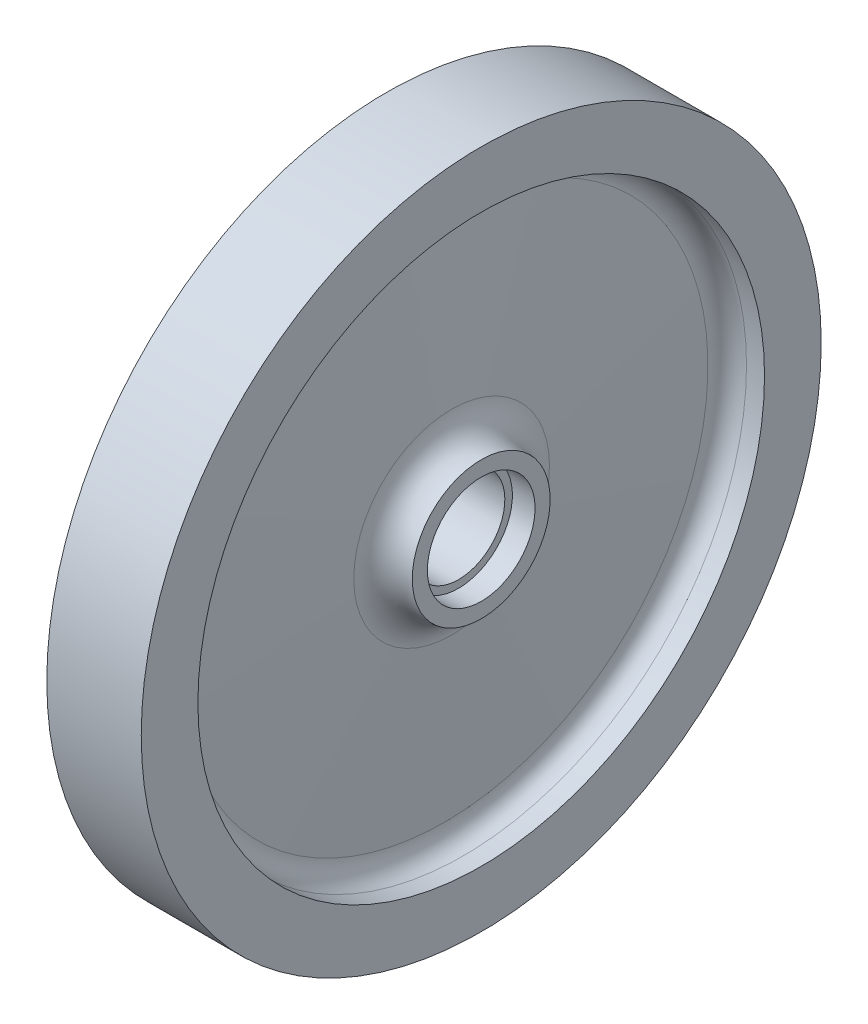
ISO-10303-21;
HEADER;
FILE_DESCRIPTION(('STEP AP214'),'2;1');
FILE_NAME('part.step','',(''),(''),'','','');
FILE_SCHEMA(('AUTOMOTIVE_DESIGN { 1 0 10303 214 1 1 1 1 }'));
ENDSEC;
DATA;
#1=APPLICATION_CONTEXT('core data for automotive mechanical design processes');
#2=APPLICATION_PROTOCOL_DEFINITION('international standard','automotive_design',2000,#1);
#3=PRODUCT_CONTEXT('',#1,'mechanical');
#4=PRODUCT('Part','Part','',(#3));
#5=PRODUCT_RELATED_PRODUCT_CATEGORY('part','',(#4));
#6=PRODUCT_DEFINITION_FORMATION('','',#4);
#7=PRODUCT_DEFINITION_CONTEXT('part definition',#1,'design');
#8=PRODUCT_DEFINITION('design','',#6,#7);
#9=PRODUCT_DEFINITION_SHAPE('','',#8);
#10=(LENGTH_UNIT() NAMED_UNIT(*) SI_UNIT(.MILLI.,.METRE.));
#11=(NAMED_UNIT(*) PLANE_ANGLE_UNIT() SI_UNIT($,.RADIAN.));
#12=(NAMED_UNIT(*) SI_UNIT($,.STERADIAN.) SOLID_ANGLE_UNIT());
#13=UNCERTAINTY_MEASURE_WITH_UNIT(LENGTH_MEASURE(1.E-05),#10,'distance_accuracy_value','');
#14=(GEOMETRIC_REPRESENTATION_CONTEXT(3) GLOBAL_UNCERTAINTY_ASSIGNED_CONTEXT((#13)) GLOBAL_UNIT_ASSIGNED_CONTEXT((#10,
#11,#12)) REPRESENTATION_CONTEXT('',''));
#15=CARTESIAN_POINT('',(0.,0.,0.));
#16=DIRECTION('',(0.,0.,1.));
#17=DIRECTION('',(1.,0.,0.));
#18=AXIS2_PLACEMENT_3D('',#15,#16,#17);
#19=CARTESIAN_POINT('',(6.5,12.25,0.));
#20=DIRECTION('',(-1.,0.,0.));
#21=DIRECTION('',(0.,0.,1.));
#22=AXIS2_PLACEMENT_3D('',#19,#20,#21);
#23=PLANE('',#22);
#24=DIRECTION('',(0.,-1.,0.));
#25=VECTOR('',#24,1.);
#26=CARTESIAN_POINT('',(6.5,14.0496316121634,-2.38125));
#27=LINE('',#26,#25);
#28=CARTESIAN_POINT('',(6.5,14.0496316121634,-2.38125000000003));
#29=VERTEX_POINT('',#28);
#30=CARTESIAN_POINT('',(6.5,12.0163284091897,-2.38125));
#31=VERTEX_POINT('',#30);
#32=EDGE_CURVE('E227',#29,#31,#27,.T.);
#33=ORIENTED_EDGE('',*,*,#32,.T.);
#34=CARTESIAN_POINT('',(6.5,0.,0.));
#35=DIRECTION('',(-1.,0.,0.));
#36=DIRECTION('',(0.,0.,1.));
#37=AXIS2_PLACEMENT_3D('',#34,#35,#36);
#38=CIRCLE('',#37,12.25);
#39=CARTESIAN_POINT('',(6.5,12.0163284091897,2.38125));
#40=VERTEX_POINT('',#39);
#41=EDGE_CURVE('E102',#31,#40,#38,.T.);
#42=ORIENTED_EDGE('',*,*,#41,.T.);
#43=DIRECTION('',(0.,1.,0.));
#44=VECTOR('',#43,1.);
#45=CARTESIAN_POINT('',(6.5,12.0163284091897,2.38125));
#46=LINE('',#45,#44);
#47=CARTESIAN_POINT('',(6.5,14.0496316121634,2.38125));
#48=VERTEX_POINT('',#47);
#49=EDGE_CURVE('E103',#40,#48,#46,.T.);
#50=ORIENTED_EDGE('',*,*,#49,.T.);
#51=CARTESIAN_POINT('',(6.5,0.,0.));
#52=DIRECTION('',(-1.,0.,0.));
#53=DIRECTION('',(0.,0.,1.));
#54=AXIS2_PLACEMENT_3D('',#51,#52,#53);
#55=CIRCLE('',#54,14.25);
#56=EDGE_CURVE('E108',#29,#48,#55,.T.);
#57=ORIENTED_EDGE('',*,*,#56,.F.);
#58=EDGE_LOOP('',(#33,#42,#50,#57));
#59=FACE_BOUND('',#58,.T.);
#60=ADVANCED_FACE('F41',(#59),#23,.F.);
#61=DIRECTION('',(0.,0.,-1.));
#62=VECTOR('',#61,1.);
#63=CARTESIAN_POINT('',(6.5,14.0496316121634,2.38125));
#64=LINE('',#63,#62);
#65=EDGE_CURVE('E64',#48,#29,#64,.T.);
#66=ORIENTED_EDGE('',*,*,#65,.T.);
#67=EDGE_CURVE('E115',#48,#29,#55,.T.);
#68=ORIENTED_EDGE('',*,*,#67,.F.);
#69=EDGE_LOOP('',(#66,#68));
#70=FACE_BOUND('',#69,.T.);
#71=ADVANCED_FACE('F155',(#70),#23,.F.);
#72=CARTESIAN_POINT('',(-13.75,0.,0.));
#73=DIRECTION('',(-1.,0.,0.));
#74=DIRECTION('',(0.,0.,1.));
#75=AXIS2_PLACEMENT_3D('',#72,#73,#74);
#76=CYLINDRICAL_SURFACE('',#75,12.25);
#77=DIRECTION('',(-1.,0.,0.));
#78=VECTOR('',#77,1.);
#79=CARTESIAN_POINT('',(12.501,12.0163284091897,-2.38125));
#80=LINE('',#79,#78);
#81=CARTESIAN_POINT('',(-6.5,12.0163284091897,-2.38125));
#82=VERTEX_POINT('',#81);
#83=EDGE_CURVE('E86',#31,#82,#80,.T.);
#84=ORIENTED_EDGE('',*,*,#83,.T.);
#85=CARTESIAN_POINT('',(-6.5,0.,0.));
#86=DIRECTION('',(-1.,0.,0.));
#87=DIRECTION('',(0.,0.,1.));
#88=AXIS2_PLACEMENT_3D('',#85,#86,#87);
#89=CIRCLE('',#88,12.25);
#90=CARTESIAN_POINT('',(-6.5,12.0163284091897,2.38125));
#91=VERTEX_POINT('',#90);
#92=EDGE_CURVE('E100',#82,#91,#89,.T.);
#93=ORIENTED_EDGE('',*,*,#92,.T.);
#94=DIRECTION('',(-1.,0.,0.));
#95=VECTOR('',#94,1.);
#96=CARTESIAN_POINT('',(12.501,12.0163284091897,2.38125));
#97=LINE('',#96,#95);
#98=EDGE_CURVE('E56',#40,#91,#97,.T.);
#99=ORIENTED_EDGE('',*,*,#98,.F.);
#100=ORIENTED_EDGE('',*,*,#41,.F.);
#101=EDGE_LOOP('',(#84,#93,#99,#100));
#102=FACE_BOUND('',#101,.T.);
#103=ADVANCED_FACE('F99',(#102),#76,.F.);
#104=CARTESIAN_POINT('',(-6.5,12.25,0.));
#105=DIRECTION('',(1.,0.,0.));
#106=DIRECTION('',(0.,0.,-1.));
#107=AXIS2_PLACEMENT_3D('',#104,#105,#106);
#108=PLANE('',#107);
#109=DIRECTION('',(0.,-1.,0.));
#110=VECTOR('',#109,1.);
#111=CARTESIAN_POINT('',(-6.5,14.0496316121634,-2.38125));
#112=LINE('',#111,#110);
#113=CARTESIAN_POINT('',(-6.5,14.0496316121634,-2.38125));
#114=VERTEX_POINT('',#113);
#115=EDGE_CURVE('E83',#114,#82,#112,.T.);
#116=ORIENTED_EDGE('',*,*,#115,.F.);
#117=CARTESIAN_POINT('',(-6.5,0.,0.));
#118=DIRECTION('',(-1.,0.,0.));
#119=DIRECTION('',(0.,0.,1.));
#120=AXIS2_PLACEMENT_3D('',#117,#118,#119);
#121=CIRCLE('',#120,14.25);
#122=CARTESIAN_POINT('',(-6.5,14.0496316121634,2.38125));
#123=VERTEX_POINT('',#122);
#124=EDGE_CURVE('E111',#114,#123,#121,.T.);
#125=ORIENTED_EDGE('',*,*,#124,.T.);
#126=DIRECTION('',(0.,1.,0.));
#127=VECTOR('',#126,1.);
#128=CARTESIAN_POINT('',(-6.5,12.0163284091897,2.38125));
#129=LINE('',#128,#127);
#130=EDGE_CURVE('E94',#91,#123,#129,.T.);
#131=ORIENTED_EDGE('',*,*,#130,.F.);
#132=ORIENTED_EDGE('',*,*,#92,.F.);
#133=EDGE_LOOP('',(#116,#125,#131,#132));
#134=FACE_BOUND('',#133,.T.);
#135=ADVANCED_FACE('F105',(#134),#108,.F.);
#136=DIRECTION('',(0.,0.,-1.));
#137=VECTOR('',#136,1.);
#138=CARTESIAN_POINT('',(-6.5,14.0496316121634,2.38125));
#139=LINE('',#138,#137);
#140=EDGE_CURVE('E222',#123,#114,#139,.T.);
#141=ORIENTED_EDGE('',*,*,#140,.F.);
#142=EDGE_CURVE('E106',#123,#114,#121,.T.);
#143=ORIENTED_EDGE('',*,*,#142,.T.);
#144=EDGE_LOOP('',(#141,#143));
#145=FACE_BOUND('',#144,.T.);
#146=ADVANCED_FACE('F179',(#145),#108,.F.);
#147=CARTESIAN_POINT('',(-13.75,0.,0.));
#148=DIRECTION('',(-1.,0.,0.));
#149=DIRECTION('',(0.,0.,1.));
#150=AXIS2_PLACEMENT_3D('',#147,#148,#149);
#151=CYLINDRICAL_SURFACE('',#150,74.999999959);
#152=CARTESIAN_POINT('',(7.72511360273218,0.,0.));
#153=DIRECTION('',(-1.,0.,0.));
#154=DIRECTION('',(0.,0.,1.));
#155=AXIS2_PLACEMENT_3D('',#152,#153,#154);
#156=CIRCLE('',#155,74.999999959);
#157=CARTESIAN_POINT('',(7.72511360273218,0.,74.999999959));
#158=VERTEX_POINT('',#157);
#159=EDGE_CURVE('E124',#158,#158,#156,.T.);
#160=ORIENTED_EDGE('',*,*,#159,.T.);
#161=EDGE_LOOP('',(#160));
#162=FACE_BOUND('',#161,.T.);
#163=CARTESIAN_POINT('',(12.5,0.,0.));
#164=DIRECTION('',(-1.,0.,0.));
#165=DIRECTION('',(0.,0.,1.));
#166=AXIS2_PLACEMENT_3D('',#163,#164,#165);
#167=CIRCLE('',#166,74.999999959);
#168=CARTESIAN_POINT('',(12.5,0.,74.999999959));
#169=VERTEX_POINT('',#168);
#170=EDGE_CURVE('E197',#169,#169,#167,.T.);
#171=ORIENTED_EDGE('',*,*,#170,.F.);
#172=EDGE_LOOP('',(#171));
#173=FACE_BOUND('',#172,.T.);
#174=ADVANCED_FACE('F176',(#162,#173),#151,.F.);
#175=CARTESIAN_POINT('',(5.,0.,0.));
#176=DIRECTION('',(-1.,0.,0.));
#177=DIRECTION('',(0.,0.,1.));
#178=AXIS2_PLACEMENT_3D('',#175,#176,#177);
#179=CONICAL_SURFACE('',#178,18.25,1.52677192732436);
#180=CARTESIAN_POINT('',(4.6631537861672,0.,0.));
#181=DIRECTION('',(1.,0.,0.));
#182=DIRECTION('',(0.,0.,-1.));
#183=AXIS2_PLACEMENT_3D('',#180,#181,#182);
#184=CIRCLE('',#183,25.8964090484802);
#185=CARTESIAN_POINT('',(4.6631537861672,0.,-25.8964090484802));
#186=VERTEX_POINT('',#185);
#187=EDGE_CURVE('E49',#186,#186,#184,.F.);
#188=ORIENTED_EDGE('',*,*,#187,.T.);
#189=EDGE_LOOP('',(#188));
#190=FACE_BOUND('',#189,.T.);
#191=CARTESIAN_POINT('',(2.72995818956812,0.,0.));
#192=DIRECTION('',(-1.,0.,0.));
#193=DIRECTION('',(0.,0.,1.));
#194=AXIS2_PLACEMENT_3D('',#191,#192,#193);
#195=CIRCLE('',#194,69.7799490595827);
#196=CARTESIAN_POINT('',(2.72995818956812,0.,69.7799490595827));
#197=VERTEX_POINT('',#196);
#198=EDGE_CURVE('E127',#197,#197,#195,.F.);
#199=ORIENTED_EDGE('',*,*,#198,.T.);
#200=EDGE_LOOP('',(#199));
#201=FACE_BOUND('',#200,.T.);
#202=ADVANCED_FACE('F138',(#190,#201),#179,.T.);
#203=CARTESIAN_POINT('',(12.5,14.25,0.));
#204=DIRECTION('',(-1.,0.,0.));
#205=DIRECTION('',(0.,0.,1.));
#206=AXIS2_PLACEMENT_3D('',#203,#204,#205);
#207=PLANE('',#206);
#208=CARTESIAN_POINT('',(12.5,0.,0.));
#209=DIRECTION('',(-1.,0.,0.));
#210=DIRECTION('',(0.,0.,1.));
#211=AXIS2_PLACEMENT_3D('',#208,#209,#210);
#212=CIRCLE('',#211,18.25);
#213=CARTESIAN_POINT('',(12.5,0.,18.25));
#214=VERTEX_POINT('',#213);
#215=EDGE_CURVE('E121',#214,#214,#212,.T.);
#216=ORIENTED_EDGE('',*,*,#215,.F.);
#217=EDGE_LOOP('',(#216));
#218=FACE_BOUND('',#217,.T.);
#219=CARTESIAN_POINT('',(12.5,0.,0.));
#220=DIRECTION('',(-1.,0.,0.));
#221=DIRECTION('',(0.,0.,1.));
#222=AXIS2_PLACEMENT_3D('',#219,#220,#221);
#223=CIRCLE('',#222,14.25);
#224=CARTESIAN_POINT('',(12.5,0.,14.25));
#225=VERTEX_POINT('',#224);
#226=EDGE_CURVE('E118',#225,#225,#223,.T.);
#227=ORIENTED_EDGE('',*,*,#226,.T.);
#228=EDGE_LOOP('',(#227));
#229=FACE_BOUND('',#228,.T.);
#230=ADVANCED_FACE('F169',(#218,#229),#207,.F.);
#231=CARTESIAN_POINT('',(-13.75,0.,0.));
#232=DIRECTION('',(-1.,0.,0.));
#233=DIRECTION('',(0.,0.,1.));
#234=AXIS2_PLACEMENT_3D('',#231,#232,#233);
#235=CYLINDRICAL_SURFACE('',#234,14.25);
#236=ORIENTED_EDGE('',*,*,#226,.F.);
#237=EDGE_LOOP('',(#236));
#238=FACE_BOUND('',#237,.T.);
#239=ORIENTED_EDGE('',*,*,#67,.T.);
#240=ORIENTED_EDGE('',*,*,#56,.T.);
#241=EDGE_LOOP('',(#239,#240));
#242=FACE_BOUND('',#241,.T.);
#243=ADVANCED_FACE('F165',(#238,#242),#235,.F.);
#244=CARTESIAN_POINT('',(-13.75,0.,0.));
#245=DIRECTION('',(-1.,0.,0.));
#246=DIRECTION('',(0.,0.,1.));
#247=AXIS2_PLACEMENT_3D('',#244,#245,#246);
#248=CYLINDRICAL_SURFACE('',#247,14.25);
#249=ORIENTED_EDGE('',*,*,#142,.F.);
#250=ORIENTED_EDGE('',*,*,#124,.F.);
#251=EDGE_LOOP('',(#249,#250));
#252=FACE_BOUND('',#251,.T.);
#253=CARTESIAN_POINT('',(-12.5,0.,0.));
#254=DIRECTION('',(-1.,0.,0.));
#255=DIRECTION('',(0.,0.,1.));
#256=AXIS2_PLACEMENT_3D('',#253,#254,#255);
#257=CIRCLE('',#256,14.25);
#258=CARTESIAN_POINT('',(-12.5,0.,14.25));
#259=VERTEX_POINT('',#258);
#260=EDGE_CURVE('E214',#259,#259,#257,.T.);
#261=ORIENTED_EDGE('',*,*,#260,.T.);
#262=EDGE_LOOP('',(#261));
#263=FACE_BOUND('',#262,.T.);
#264=ADVANCED_FACE('F168',(#252,#263),#248,.F.);
#265=CARTESIAN_POINT('',(-12.5,14.25,0.));
#266=DIRECTION('',(1.,0.,0.));
#267=DIRECTION('',(0.,0.,-1.));
#268=AXIS2_PLACEMENT_3D('',#265,#266,#267);
#269=PLANE('',#268);
#270=ORIENTED_EDGE('',*,*,#260,.F.);
#271=EDGE_LOOP('',(#270));
#272=FACE_BOUND('',#271,.T.);
#273=CARTESIAN_POINT('',(-12.5,0.,0.));
#274=DIRECTION('',(-1.,0.,0.));
#275=DIRECTION('',(0.,0.,1.));
#276=AXIS2_PLACEMENT_3D('',#273,#274,#275);
#277=CIRCLE('',#276,18.25);
#278=CARTESIAN_POINT('',(-12.5,0.,18.25));
#279=VERTEX_POINT('',#278);
#280=EDGE_CURVE('E212',#279,#279,#277,.T.);
#281=ORIENTED_EDGE('',*,*,#280,.T.);
#282=EDGE_LOOP('',(#281));
#283=FACE_BOUND('',#282,.T.);
#284=ADVANCED_FACE('F255',(#272,#283),#269,.F.);
#285=CARTESIAN_POINT('',(-2.5,0.,0.));
#286=DIRECTION('',(1.,0.,0.));
#287=DIRECTION('',(0.,0.,-1.));
#288=AXIS2_PLACEMENT_3D('',#285,#286,#287);
#289=CONICAL_SURFACE('',#288,74.999999959,1.52677192732436);
#290=CARTESIAN_POINT('',(-4.66315378616721,0.,0.));
#291=DIRECTION('',(-1.,0.,0.));
#292=DIRECTION('',(0.,0.,1.));
#293=AXIS2_PLACEMENT_3D('',#290,#291,#292);
#294=CIRCLE('',#293,25.8964090484802);
#295=CARTESIAN_POINT('',(-4.66315378616721,0.,25.8964090484802));
#296=VERTEX_POINT('',#295);
#297=EDGE_CURVE('E11',#296,#296,#294,.F.);
#298=ORIENTED_EDGE('',*,*,#297,.T.);
#299=EDGE_LOOP('',(#298));
#300=FACE_BOUND('',#299,.T.);
#301=CARTESIAN_POINT('',(-2.72995818956812,0.,0.));
#302=DIRECTION('',(1.,0.,0.));
#303=DIRECTION('',(0.,0.,-1.));
#304=AXIS2_PLACEMENT_3D('',#301,#302,#303);
#305=CIRCLE('',#304,69.7799490595827);
#306=CARTESIAN_POINT('',(-2.72995818956812,0.,-69.7799490595827));
#307=VERTEX_POINT('',#306);
#308=EDGE_CURVE('E130',#307,#307,#305,.F.);
#309=ORIENTED_EDGE('',*,*,#308,.T.);
#310=EDGE_LOOP('',(#309));
#311=FACE_BOUND('',#310,.T.);
#312=ADVANCED_FACE('F252',(#300,#311),#289,.T.);
#313=CARTESIAN_POINT('',(-13.75,0.,0.));
#314=DIRECTION('',(-1.,0.,0.));
#315=DIRECTION('',(0.,0.,1.));
#316=AXIS2_PLACEMENT_3D('',#313,#314,#315);
#317=CYLINDRICAL_SURFACE('',#316,74.999999959);
#318=CARTESIAN_POINT('',(-7.72511360273218,0.,0.));
#319=DIRECTION('',(-1.,0.,0.));
#320=DIRECTION('',(0.,0.,1.));
#321=AXIS2_PLACEMENT_3D('',#318,#319,#320);
#322=CIRCLE('',#321,74.999999959);
#323=CARTESIAN_POINT('',(-7.72511360273218,0.,74.999999959));
#324=VERTEX_POINT('',#323);
#325=EDGE_CURVE('E133',#324,#324,#322,.F.);
#326=ORIENTED_EDGE('',*,*,#325,.T.);
#327=EDGE_LOOP('',(#326));
#328=FACE_BOUND('',#327,.T.);
#329=CARTESIAN_POINT('',(-12.5,0.,0.));
#330=DIRECTION('',(-1.,0.,0.));
#331=DIRECTION('',(0.,0.,1.));
#332=AXIS2_PLACEMENT_3D('',#329,#330,#331);
#333=CIRCLE('',#332,74.999999959);
#334=CARTESIAN_POINT('',(-12.5,0.,74.999999959));
#335=VERTEX_POINT('',#334);
#336=EDGE_CURVE('E209',#335,#335,#333,.T.);
#337=ORIENTED_EDGE('',*,*,#336,.T.);
#338=EDGE_LOOP('',(#337));
#339=FACE_BOUND('',#338,.T.);
#340=ADVANCED_FACE('F249',(#328,#339),#317,.F.);
#341=CARTESIAN_POINT('',(-12.5,89.999999959,0.));
#342=DIRECTION('',(1.,0.,0.));
#343=DIRECTION('',(0.,0.,-1.));
#344=AXIS2_PLACEMENT_3D('',#341,#342,#343);
#345=PLANE('',#344);
#346=ORIENTED_EDGE('',*,*,#336,.F.);
#347=EDGE_LOOP('',(#346));
#348=FACE_BOUND('',#347,.T.);
#349=CARTESIAN_POINT('',(-12.5,0.,0.));
#350=DIRECTION('',(-1.,0.,0.));
#351=DIRECTION('',(0.,0.,1.));
#352=AXIS2_PLACEMENT_3D('',#349,#350,#351);
#353=CIRCLE('',#352,89.999999959);
#354=CARTESIAN_POINT('',(-12.5,0.,89.999999959));
#355=VERTEX_POINT('',#354);
#356=EDGE_CURVE('E202',#355,#355,#353,.T.);
#357=ORIENTED_EDGE('',*,*,#356,.T.);
#358=EDGE_LOOP('',(#357));
#359=FACE_BOUND('',#358,.T.);
#360=ADVANCED_FACE('F245',(#348,#359),#345,.F.);
#361=CARTESIAN_POINT('',(-13.75,0.,0.));
#362=DIRECTION('',(-1.,0.,0.));
#363=DIRECTION('',(0.,0.,1.));
#364=AXIS2_PLACEMENT_3D('',#361,#362,#363);
#365=CYLINDRICAL_SURFACE('',#364,89.999999959);
#366=ORIENTED_EDGE('',*,*,#356,.F.);
#367=EDGE_LOOP('',(#366));
#368=FACE_BOUND('',#367,.T.);
#369=CARTESIAN_POINT('',(12.5,0.,0.));
#370=DIRECTION('',(-1.,0.,0.));
#371=DIRECTION('',(0.,0.,1.));
#372=AXIS2_PLACEMENT_3D('',#369,#370,#371);
#373=CIRCLE('',#372,89.999999959);
#374=CARTESIAN_POINT('',(12.5,0.,89.999999959));
#375=VERTEX_POINT('',#374);
#376=EDGE_CURVE('E199',#375,#375,#373,.T.);
#377=ORIENTED_EDGE('',*,*,#376,.T.);
#378=EDGE_LOOP('',(#377));
#379=FACE_BOUND('',#378,.T.);
#380=ADVANCED_FACE('F188',(#368,#379),#365,.T.);
#381=CARTESIAN_POINT('',(12.5,89.999999959,0.));
#382=DIRECTION('',(-1.,0.,0.));
#383=DIRECTION('',(0.,0.,1.));
#384=AXIS2_PLACEMENT_3D('',#381,#382,#383);
#385=PLANE('',#384);
#386=ORIENTED_EDGE('',*,*,#376,.F.);
#387=EDGE_LOOP('',(#386));
#388=FACE_BOUND('',#387,.T.);
#389=ORIENTED_EDGE('',*,*,#170,.T.);
#390=EDGE_LOOP('',(#389));
#391=FACE_BOUND('',#390,.T.);
#392=ADVANCED_FACE('F182',(#388,#391),#385,.F.);
#393=CARTESIAN_POINT('',(7.72511360273218,0.,0.));
#394=DIRECTION('',(-1.,0.,0.));
#395=DIRECTION('',(0.,0.,1.));
#396=AXIS2_PLACEMENT_3D('',#393,#394,#395);
#397=TOROIDAL_SURFACE('',#396,69.999999959,5.);
#398=ORIENTED_EDGE('',*,*,#198,.F.);
#399=EDGE_LOOP('',(#398));
#400=FACE_BOUND('',#399,.T.);
#401=ORIENTED_EDGE('',*,*,#159,.F.);
#402=EDGE_LOOP('',(#401));
#403=FACE_BOUND('',#402,.T.);
#404=ADVANCED_FACE('F151',(#400,#403),#397,.F.);
#405=CARTESIAN_POINT('',(-7.72511360273218,0.,0.));
#406=DIRECTION('',(-1.,0.,0.));
#407=DIRECTION('',(0.,0.,1.));
#408=AXIS2_PLACEMENT_3D('',#405,#406,#407);
#409=TOROIDAL_SURFACE('',#408,69.999999959,5.);
#410=ORIENTED_EDGE('',*,*,#325,.F.);
#411=EDGE_LOOP('',(#410));
#412=FACE_BOUND('',#411,.T.);
#413=ORIENTED_EDGE('',*,*,#308,.F.);
#414=EDGE_LOOP('',(#413));
#415=FACE_BOUND('',#414,.T.);
#416=ADVANCED_FACE('F143',(#412,#415),#409,.F.);
#417=CARTESIAN_POINT('',(12.6554024472302,0.,0.));
#418=DIRECTION('',(1.,0.,0.));
#419=DIRECTION('',(0.,0.,-1.));
#420=AXIS2_PLACEMENT_3D('',#417,#418,#419);
#421=TOROIDAL_SURFACE('',#420,26.2484904875479,8.);
#422=ORIENTED_EDGE('',*,*,#215,.T.);
#423=EDGE_LOOP('',(#422));
#424=FACE_BOUND('',#423,.T.);
#425=ORIENTED_EDGE('',*,*,#187,.F.);
#426=EDGE_LOOP('',(#425));
#427=FACE_BOUND('',#426,.T.);
#428=ADVANCED_FACE('F141',(#424,#427),#421,.F.);
#429=CARTESIAN_POINT('',(-12.6554024472303,0.,0.));
#430=DIRECTION('',(-1.,0.,0.));
#431=DIRECTION('',(0.,0.,1.));
#432=AXIS2_PLACEMENT_3D('',#429,#430,#431);
#433=TOROIDAL_SURFACE('',#432,26.2484904875479,8.);
#434=ORIENTED_EDGE('',*,*,#297,.F.);
#435=EDGE_LOOP('',(#434));
#436=FACE_BOUND('',#435,.T.);
#437=ORIENTED_EDGE('',*,*,#280,.F.);
#438=EDGE_LOOP('',(#437));
#439=FACE_BOUND('',#438,.T.);
#440=ADVANCED_FACE('F43',(#436,#439),#433,.F.);
#441=CARTESIAN_POINT('',(12.501,14.0496316121634,-2.38125));
#442=DIRECTION('',(0.,0.,1.));
#443=DIRECTION('',(1.,0.,0.));
#444=AXIS2_PLACEMENT_3D('',#441,#442,#443);
#445=PLANE('',#444);
#446=DIRECTION('',(-1.,0.,0.));
#447=VECTOR('',#446,1.);
#448=CARTESIAN_POINT('',(12.501,14.0496316121634,-2.38125));
#449=LINE('',#448,#447);
#450=EDGE_CURVE('E88',#29,#114,#449,.T.);
#451=ORIENTED_EDGE('',*,*,#450,.T.);
#452=ORIENTED_EDGE('',*,*,#115,.T.);
#453=ORIENTED_EDGE('',*,*,#83,.F.);
#454=ORIENTED_EDGE('',*,*,#32,.F.);
#455=EDGE_LOOP('',(#451,#452,#453,#454));
#456=FACE_BOUND('',#455,.T.);
#457=ADVANCED_FACE('F85',(#456),#445,.T.);
#458=CARTESIAN_POINT('',(12.501,14.0496316121634,2.38125));
#459=DIRECTION('',(0.,-1.,0.));
#460=DIRECTION('',(0.,0.,-1.));
#461=AXIS2_PLACEMENT_3D('',#458,#459,#460);
#462=PLANE('',#461);
#463=DIRECTION('',(-1.,0.,0.));
#464=VECTOR('',#463,1.);
#465=CARTESIAN_POINT('',(12.501,14.0496316121634,2.38125));
#466=LINE('',#465,#464);
#467=EDGE_CURVE('E230',#48,#123,#466,.T.);
#468=ORIENTED_EDGE('',*,*,#467,.T.);
#469=ORIENTED_EDGE('',*,*,#140,.T.);
#470=ORIENTED_EDGE('',*,*,#450,.F.);
#471=ORIENTED_EDGE('',*,*,#65,.F.);
#472=EDGE_LOOP('',(#468,#469,#470,#471));
#473=FACE_BOUND('',#472,.T.);
#474=ADVANCED_FACE('F232',(#473),#462,.T.);
#475=CARTESIAN_POINT('',(12.501,12.0163284091897,2.38125));
#476=DIRECTION('',(0.,0.,-1.));
#477=DIRECTION('',(-1.,0.,0.));
#478=AXIS2_PLACEMENT_3D('',#475,#476,#477);
#479=PLANE('',#478);
#480=ORIENTED_EDGE('',*,*,#98,.T.);
#481=ORIENTED_EDGE('',*,*,#130,.T.);
#482=ORIENTED_EDGE('',*,*,#467,.F.);
#483=ORIENTED_EDGE('',*,*,#49,.F.);
#484=EDGE_LOOP('',(#480,#481,#482,#483));
#485=FACE_BOUND('',#484,.T.);
#486=ADVANCED_FACE('F233',(#485),#479,.T.);
#487=CLOSED_SHELL('',(#60,#71,#103,#135,#146,#174,#202,#230,#243,#264,#284,#312,#340,#360,#380,
#392,#404,#416,#428,#440,#457,#474,#486));
#488=MANIFOLD_SOLID_BREP('B2',#487);
#489=ADVANCED_BREP_SHAPE_REPRESENTATION('',(#18,#488),#14);
#490=SHAPE_DEFINITION_REPRESENTATION(#9,#489);
ENDSEC;
END-ISO-10303-21;
